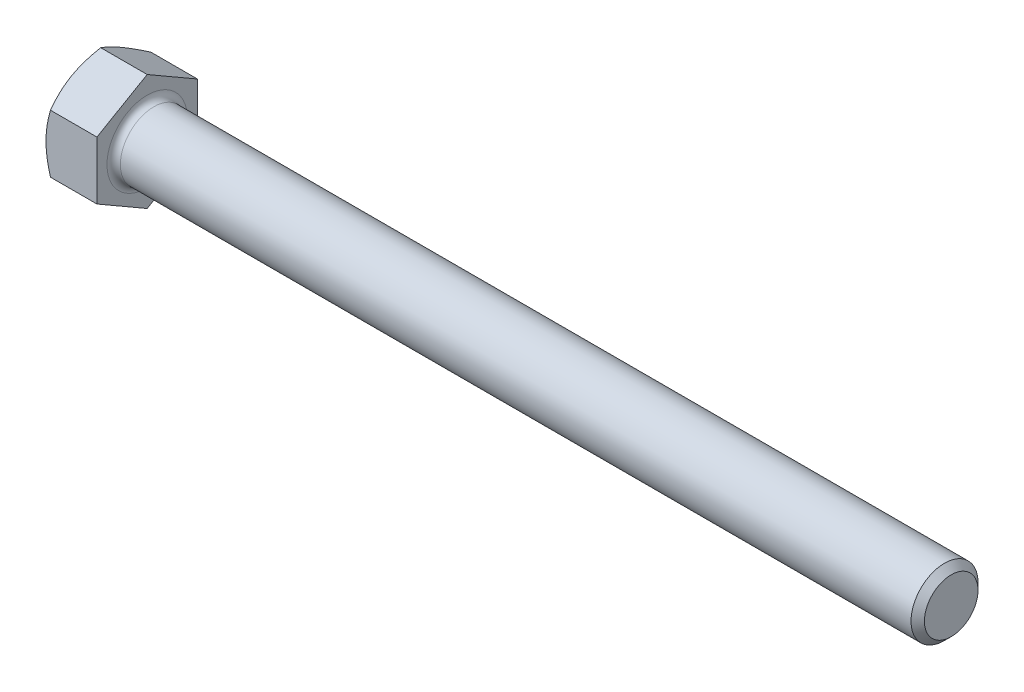
ISO-10303-21;
HEADER;
FILE_DESCRIPTION(('STEP AP214'),'2;1');
FILE_NAME('part.step','',(''),(''),'','','');
FILE_SCHEMA(('AUTOMOTIVE_DESIGN { 1 0 10303 214 1 1 1 1 }'));
ENDSEC;
DATA;
#1=APPLICATION_CONTEXT('core data for automotive mechanical design processes');
#2=APPLICATION_PROTOCOL_DEFINITION('international standard','automotive_design',2000,#1);
#3=PRODUCT_CONTEXT('',#1,'mechanical');
#4=PRODUCT('Part','Part','',(#3));
#5=PRODUCT_RELATED_PRODUCT_CATEGORY('part','',(#4));
#6=PRODUCT_DEFINITION_FORMATION('','',#4);
#7=PRODUCT_DEFINITION_CONTEXT('part definition',#1,'design');
#8=PRODUCT_DEFINITION('design','',#6,#7);
#9=PRODUCT_DEFINITION_SHAPE('','',#8);
#10=(LENGTH_UNIT() NAMED_UNIT(*) SI_UNIT(.MILLI.,.METRE.));
#11=(NAMED_UNIT(*) PLANE_ANGLE_UNIT() SI_UNIT($,.RADIAN.));
#12=(NAMED_UNIT(*) SI_UNIT($,.STERADIAN.) SOLID_ANGLE_UNIT());
#13=UNCERTAINTY_MEASURE_WITH_UNIT(LENGTH_MEASURE(1.E-05),#10,'distance_accuracy_value','');
#14=(GEOMETRIC_REPRESENTATION_CONTEXT(3) GLOBAL_UNCERTAINTY_ASSIGNED_CONTEXT((#13)) GLOBAL_UNIT_ASSIGNED_CONTEXT((#10,
#11,#12)) REPRESENTATION_CONTEXT('',''));
#15=CARTESIAN_POINT('',(0.,0.,0.));
#16=DIRECTION('',(0.,0.,1.));
#17=DIRECTION('',(1.,0.,0.));
#18=AXIS2_PLACEMENT_3D('',#15,#16,#17);
#19=CARTESIAN_POINT('',(-4.826,2.74963065701559,-4.7625));
#20=DIRECTION('',(0.,-0.866025403784439,0.499999999999999));
#21=DIRECTION('',(0.,-0.5,-0.866025403784439));
#22=AXIS2_PLACEMENT_3D('',#19,#20,#21);
#23=PLANE('',#22);
#24=CARTESIAN_POINT('',(-4.40056398824924,5.49937678408502,0.000200000000005412));
#25=CARTESIAN_POINT('',(-4.47034638758606,5.37853889601657,-0.209097361613873));
#26=CARTESIAN_POINT('',(-4.53381673538478,5.25666747870888,-0.420184848381223));
#27=CARTESIAN_POINT('',(-4.64460480393128,5.01081433128269,-0.846014990924108));
#28=CARTESIAN_POINT('',(-4.69188333457021,4.88682823299882,-1.060765212584));
#29=CARTESIAN_POINT('',(-4.76546647463122,4.64037371706653,-1.48763695593352));
#30=CARTESIAN_POINT('',(-4.79226120779827,4.5179436811604,-1.69969199849541));
#31=CARTESIAN_POINT('',(-4.81628887781912,4.33386795649884,-2.01852050604929));
#32=CARTESIAN_POINT('',(-4.82160535899069,4.27246738882597,-2.12486940887228));
#33=CARTESIAN_POINT('',(-4.8267598365683,4.1496095068933,-2.33766550248997));
#34=CARTESIAN_POINT('',(-4.82659800219079,4.08815219444488,-2.44411269014726));
#35=CARTESIAN_POINT('',(-4.81861505017809,3.9197756106675,-2.73574948805455));
#36=CARTESIAN_POINT('',(-4.80520757951211,3.81291212955969,-2.92084246680696));
#37=CARTESIAN_POINT('',(-4.76269213715631,3.59989441060936,-3.28979997894136));
#38=CARTESIAN_POINT('',(-4.7335696317199,3.49374092153974,-3.47366321541066));
#39=CARTESIAN_POINT('',(-4.6607707464131,3.28029401006835,-3.84336411079776));
#40=CARTESIAN_POINT('',(-4.61678588695335,3.17302752682367,-4.02915510972678));
#41=CARTESIAN_POINT('',(-4.51695772006118,2.96009430473234,-4.39796626900832));
#42=CARTESIAN_POINT('',(-4.46113786532195,2.85442483842812,-4.5809911534559));
#43=CARTESIAN_POINT('',(-4.40056398824924,2.74951518696175,-4.7627));
#44=B_SPLINE_CURVE_WITH_KNOTS('',3,(#24,#25,#26,#27,#28,#29,#30,#31,#32,#33,#34,#35,#36,#37,#38,
#39,#40,#41,#42,#43),.UNSPECIFIED.,.F.,.F.,(4,2,2,2,2,2,2,2,2,4),(0.,0.754910190012916,
1.51163483480638,2.24963134670894,2.61827336240839,2.9869039913527,3.62867423192249,
4.27103902109236,4.92765153591996,5.58297484368455),.UNSPECIFIED.);
#45=CARTESIAN_POINT('',(-4.4006306570156,5.49926131403118,0.));
#46=VERTEX_POINT('',#45);
#47=CARTESIAN_POINT('',(-4.826,4.12444598552339,-2.38124999999999));
#48=VERTEX_POINT('',#47);
#49=EDGE_CURVE('E112',#46,#48,#44,.T.);
#50=ORIENTED_EDGE('',*,*,#49,.F.);
#51=DIRECTION('',(1.,0.,0.));
#52=VECTOR('',#51,1.);
#53=CARTESIAN_POINT('',(-4.826,5.49926131403118,0.));
#54=LINE('',#53,#52);
#55=CARTESIAN_POINT('',(0.,5.49926131403118,0.));
#56=VERTEX_POINT('',#55);
#57=EDGE_CURVE('E125',#46,#56,#54,.T.);
#58=ORIENTED_EDGE('',*,*,#57,.T.);
#59=DIRECTION('',(0.,-0.5,-0.866025403784439));
#60=VECTOR('',#59,1.);
#61=CARTESIAN_POINT('',(0.,2.74963065701559,-4.7625));
#62=LINE('',#61,#60);
#63=CARTESIAN_POINT('',(0.,2.74963065701559,-4.7625));
#64=VERTEX_POINT('',#63);
#65=EDGE_CURVE('E129',#56,#64,#62,.T.);
#66=ORIENTED_EDGE('',*,*,#65,.T.);
#67=DIRECTION('',(1.,0.,0.));
#68=VECTOR('',#67,1.);
#69=CARTESIAN_POINT('',(-4.826,2.74963065701559,-4.7625));
#70=LINE('',#69,#68);
#71=CARTESIAN_POINT('',(-4.4006306570156,2.74963065701559,-4.7625));
#72=VERTEX_POINT('',#71);
#73=EDGE_CURVE('E148',#72,#64,#70,.T.);
#74=ORIENTED_EDGE('',*,*,#73,.F.);
#75=EDGE_CURVE('E128',#48,#72,#44,.T.);
#76=ORIENTED_EDGE('',*,*,#75,.F.);
#77=EDGE_LOOP('',(#50,#58,#66,#74,#76));
#78=FACE_BOUND('',#77,.T.);
#79=ADVANCED_FACE('F36',(#78),#23,.F.);
#80=CARTESIAN_POINT('',(-4.826,-2.74963065701559,-4.7625));
#81=DIRECTION('',(0.,0.,1.));
#82=DIRECTION('',(0.,-1.,0.));
#83=AXIS2_PLACEMENT_3D('',#80,#81,#82);
#84=PLANE('',#83);
#85=CARTESIAN_POINT('',(-2.53865492995422,-7.30971731156661,-4.7625));
#86=CARTESIAN_POINT('',(-2.63894582516318,-7.10233411794664,-4.7625));
#87=CARTESIAN_POINT('',(-2.73825279152594,-6.89446659321094,-4.7625));
#88=CARTESIAN_POINT('',(-2.93434388978706,-6.47750501700678,-4.7625));
#89=CARTESIAN_POINT('',(-3.03112760832201,-6.26841077136273,-4.7625));
#90=CARTESIAN_POINT('',(-3.22212058726197,-5.84762353880586,-4.7625));
#91=CARTESIAN_POINT('',(-3.31631227627624,-5.63592254799053,-4.7625));
#92=CARTESIAN_POINT('',(-3.50073783411751,-5.2108098706162,-4.7625));
#93=CARTESIAN_POINT('',(-3.59097189530315,-4.99739826779835,-4.7625));
#94=CARTESIAN_POINT('',(-3.76913037535412,-4.56193618326943,-4.7625));
#95=CARTESIAN_POINT('',(-3.85689893159286,-4.33982157619656,-4.7625));
#96=CARTESIAN_POINT('',(-4.02560705643309,-3.89296573863796,-4.7625));
#97=CARTESIAN_POINT('',(-4.10654584809015,-3.6682242126196,-4.7625));
#98=CARTESIAN_POINT('',(-4.25941364359694,-3.21620296888463,-4.7625));
#99=CARTESIAN_POINT('',(-4.33136156692013,-2.98892971583964,-4.7625));
#100=CARTESIAN_POINT('',(-4.46388883392356,-2.53112455985058,-4.7625));
#101=CARTESIAN_POINT('',(-4.52447184026846,-2.30059373259607,-4.7625));
#102=CARTESIAN_POINT('',(-4.6309943175041,-1.83740766983983,-4.7625));
#103=CARTESIAN_POINT('',(-4.67701029190918,-1.60477036374114,-4.7625));
#104=CARTESIAN_POINT('',(-4.75174576579707,-1.13668440796651,-4.7625));
#105=CARTESIAN_POINT('',(-4.78046675134188,-0.901236001606197,-4.7625));
#106=CARTESIAN_POINT('',(-4.81794377379008,-0.431746037216489,-4.7625));
#107=CARTESIAN_POINT('',(-4.82695039796689,-0.197724985343648,-4.7625));
#108=CARTESIAN_POINT('',(-4.82489021390358,0.270245165970698,-4.7625));
#109=CARTESIAN_POINT('',(-4.81382285651618,0.504194263268692,-4.7625));
#110=CARTESIAN_POINT('',(-4.77855727161905,0.903673507099814,-4.7625));
#111=CARTESIAN_POINT('',(-4.75901888428981,1.06963824347709,-4.7625));
#112=CARTESIAN_POINT('',(-4.71109832669434,1.4002949446895,-4.7625));
#113=CARTESIAN_POINT('',(-4.68271488786702,1.56498672348217,-4.7625));
#114=CARTESIAN_POINT('',(-4.58579509515289,2.05696621832222,-4.7625));
#115=CARTESIAN_POINT('',(-4.50550882608358,2.38196188542261,-4.7625));
#116=CARTESIAN_POINT('',(-4.36703014941268,2.86781398854699,-4.7625));
#117=CARTESIAN_POINT('',(-4.31723714803653,3.03120713132935,-4.7625));
#118=CARTESIAN_POINT('',(-4.21266440559822,3.35640511661037,-4.7625));
#119=CARTESIAN_POINT('',(-4.15788463273706,3.51820994897361,-4.7625));
#120=CARTESIAN_POINT('',(-4.04420190764095,3.84028616885704,-4.7625));
#121=CARTESIAN_POINT('',(-3.9853004369361,4.00055808407178,-4.7625));
#122=CARTESIAN_POINT('',(-3.86404874825557,4.31978669318692,-4.7625));
#123=CARTESIAN_POINT('',(-3.80169856215817,4.47874339922889,-4.7625));
#124=CARTESIAN_POINT('',(-3.65635700460677,4.8396055882017,-4.7625));
#125=CARTESIAN_POINT('',(-3.57245322794143,5.04114279911414,-4.7625));
#126=CARTESIAN_POINT('',(-3.40089342493739,5.44261795808367,-4.7625));
#127=CARTESIAN_POINT('',(-3.31323721756385,5.64255582842752,-4.76249999999999));
#128=CARTESIAN_POINT('',(-3.13488930867042,6.04110971320488,-4.76249999999999));
#129=CARTESIAN_POINT('',(-3.04419710529245,6.23972550252466,-4.76249999999999));
#130=CARTESIAN_POINT('',(-2.86034980666286,6.63581552297746,-4.76249999999999));
#131=CARTESIAN_POINT('',(-2.76719466563982,6.83328973281206,-4.76249999999999));
#132=CARTESIAN_POINT('',(-2.48455741628422,7.42461069797956,-4.76249999999999));
#133=CARTESIAN_POINT('',(-2.29205806653975,7.817014673705,-4.76249999999999));
#134=CARTESIAN_POINT('',(-1.90151383619552,8.5990520506164,-4.76249999999999));
#135=CARTESIAN_POINT('',(-1.70346877205877,8.98868535956997,-4.76249999999999));
#136=CARTESIAN_POINT('',(-1.31897377005232,9.7356118369776,-4.76249999999999));
#137=CARTESIAN_POINT('',(-1.13282282853607,10.093059202551,-4.76249999999999));
#138=CARTESIAN_POINT('',(-0.75794689692703,10.8066127209674,-4.76249999999999));
#139=CARTESIAN_POINT('',(-0.569221831900088,11.1627188343791,-4.76249999999999));
#140=CARTESIAN_POINT('',(-0.190210631481143,11.8730921528281,-4.76249999999999));
#141=CARTESIAN_POINT('',(7.11576984302486E-05,12.2273616797313,-4.76249999999999));
#142=CARTESIAN_POINT('',(0.382198882261842,12.9350341524318,-4.76249999999999));
#143=CARTESIAN_POINT('',(0.574044740694436,13.2884371397628,-4.76249999999999));
#144=CARTESIAN_POINT('',(0.766479229564005,13.6415169914972,-4.76249999999999));
#145=B_SPLINE_CURVE_WITH_KNOTS('',3,(#85,#86,#87,#88,#89,#90,#91,#92,#93,#94,#95,#96,#97,#98,
#99,#100,#101,#102,#103,#104,#105,#106,#107,#108,#109,#110,#111,#112,#113,#114,#115,#116,#117,
#118,#119,#120,#121,#122,#123,#124,#125,#126,#127,#128,#129,#130,#131,#132,#133,#134,#135,#136,
#137,#138,#139,#140,#141,#142,#143,#144),.UNSPECIFIED.,.F.,.F.,(4,2,2,2,2,2,2,2,2,2,2,2,2,2,2,2,
2,2,2,2,2,2,2,2,2,2,2,2,2,4),(0.,0.691090929530282,1.38229437243686,2.07739107275608,
2.77245395070163,3.48884745798766,4.20532235163324,4.92026322857102,5.63497329833932,
6.3458650497355,7.05669570944579,7.75843728919175,8.46019806619033,8.96128606484996,
9.46244596286593,10.4653546355007,10.9777490611263,11.4901467543507,12.0023612047988,
12.514570921371,13.1694362862203,13.8243332805291,14.4793390708444,15.1343570424044,
16.4455162651803,17.7567189325479,18.9657490980689,20.1748145345615,21.3812208217427,
22.5875681084214),.UNSPECIFIED.);
#146=CARTESIAN_POINT('',(-4.826,0.,-4.7625));
#147=VERTEX_POINT('',#146);
#148=EDGE_CURVE('E194',#72,#147,#145,.F.);
#149=ORIENTED_EDGE('',*,*,#148,.F.);
#150=ORIENTED_EDGE('',*,*,#73,.T.);
#151=DIRECTION('',(0.,-1.,0.));
#152=VECTOR('',#151,1.);
#153=CARTESIAN_POINT('',(0.,-2.74963065701559,-4.7625));
#154=LINE('',#153,#152);
#155=CARTESIAN_POINT('',(0.,-2.74963065701559,-4.7625));
#156=VERTEX_POINT('',#155);
#157=EDGE_CURVE('E404',#64,#156,#154,.T.);
#158=ORIENTED_EDGE('',*,*,#157,.T.);
#159=DIRECTION('',(1.,0.,0.));
#160=VECTOR('',#159,1.);
#161=CARTESIAN_POINT('',(-4.826,-2.74963065701559,-4.7625));
#162=LINE('',#161,#160);
#163=CARTESIAN_POINT('',(-4.4006306570156,-2.74963065701559,-4.7625));
#164=VERTEX_POINT('',#163);
#165=EDGE_CURVE('E146',#164,#156,#162,.T.);
#166=ORIENTED_EDGE('',*,*,#165,.F.);
#167=EDGE_CURVE('E195',#147,#164,#145,.F.);
#168=ORIENTED_EDGE('',*,*,#167,.F.);
#169=EDGE_LOOP('',(#149,#150,#158,#166,#168));
#170=FACE_BOUND('',#169,.T.);
#171=ADVANCED_FACE('F174',(#170),#84,.F.);
#172=CARTESIAN_POINT('',(-4.826,-5.49926131403118,0.));
#173=DIRECTION('',(0.,0.866025403784438,0.5));
#174=DIRECTION('',(0.,-0.5,0.866025403784438));
#175=AXIS2_PLACEMENT_3D('',#172,#173,#174);
#176=PLANE('',#175);
#177=CARTESIAN_POINT('',(-4.40056398824924,-2.74951518696175,-4.7627));
#178=CARTESIAN_POINT('',(-4.47034638758606,-2.8703530750302,-4.55340263838612));
#179=CARTESIAN_POINT('',(-4.53381673538478,-2.9922244923379,-4.34231515161877));
#180=CARTESIAN_POINT('',(-4.64460480393128,-3.23807763976409,-3.91648500907589));
#181=CARTESIAN_POINT('',(-4.69188333457021,-3.36206373804796,-3.701734787416));
#182=CARTESIAN_POINT('',(-4.76546647463122,-3.60851825398025,-3.27486304406647));
#183=CARTESIAN_POINT('',(-4.79226120779827,-3.73094828988637,-3.06280800150458));
#184=CARTESIAN_POINT('',(-4.81628887781913,-3.91502401454793,-2.7439794939507));
#185=CARTESIAN_POINT('',(-4.82160535899069,-3.97642458222081,-2.63763059112771));
#186=CARTESIAN_POINT('',(-4.8267598365683,-4.09928246415348,-2.42483449751002));
#187=CARTESIAN_POINT('',(-4.8265980021908,-4.16073977660189,-2.31838730985274));
#188=CARTESIAN_POINT('',(-4.81861505017809,-4.32911636037927,-2.02675051194544));
#189=CARTESIAN_POINT('',(-4.80520757951211,-4.43597984148709,-1.84165753319303));
#190=CARTESIAN_POINT('',(-4.76269213715631,-4.64899756043742,-1.47270002105863));
#191=CARTESIAN_POINT('',(-4.7335696317199,-4.75515104950704,-1.28883678458933));
#192=CARTESIAN_POINT('',(-4.6607707464131,-4.96859796097843,-0.919135889202234));
#193=CARTESIAN_POINT('',(-4.61678588695335,-5.07586444422311,-0.733344890273215));
#194=CARTESIAN_POINT('',(-4.51695772006118,-5.28879766631444,-0.364533730991682));
#195=CARTESIAN_POINT('',(-4.46113786532195,-5.39446713261865,-0.181508846544095));
#196=CARTESIAN_POINT('',(-4.40056398824924,-5.49937678408502,0.000199999999996824));
#197=B_SPLINE_CURVE_WITH_KNOTS('',3,(#177,#178,#179,#180,#181,#182,#183,#184,#185,#186,#187,
#188,#189,#190,#191,#192,#193,#194,#195,#196),.UNSPECIFIED.,.F.,.F.,(4,2,2,2,2,2,2,2,2,4),(0.,
0.754910190012917,1.51163483480638,2.24963134670895,2.61827336240839,2.9869039913527,
3.6286742319225,4.27103902109236,4.92765153591996,5.58297484368455),.UNSPECIFIED.);
#198=CARTESIAN_POINT('',(-4.826,-4.12444598552338,-2.38125));
#199=VERTEX_POINT('',#198);
#200=EDGE_CURVE('E233',#164,#199,#197,.T.);
#201=ORIENTED_EDGE('',*,*,#200,.F.);
#202=ORIENTED_EDGE('',*,*,#165,.T.);
#203=DIRECTION('',(0.,-0.5,0.866025403784438));
#204=VECTOR('',#203,1.);
#205=CARTESIAN_POINT('',(0.,-5.49926131403118,0.));
#206=LINE('',#205,#204);
#207=CARTESIAN_POINT('',(0.,-5.49926131403118,0.));
#208=VERTEX_POINT('',#207);
#209=EDGE_CURVE('E405',#156,#208,#206,.T.);
#210=ORIENTED_EDGE('',*,*,#209,.T.);
#211=DIRECTION('',(1.,0.,0.));
#212=VECTOR('',#211,1.);
#213=CARTESIAN_POINT('',(-4.826,-5.49926131403118,0.));
#214=LINE('',#213,#212);
#215=CARTESIAN_POINT('',(-4.4006306570156,-5.49926131403118,0.));
#216=VERTEX_POINT('',#215);
#217=EDGE_CURVE('E144',#216,#208,#214,.T.);
#218=ORIENTED_EDGE('',*,*,#217,.F.);
#219=EDGE_CURVE('E229',#199,#216,#197,.T.);
#220=ORIENTED_EDGE('',*,*,#219,.F.);
#221=EDGE_LOOP('',(#201,#202,#210,#218,#220));
#222=FACE_BOUND('',#221,.T.);
#223=ADVANCED_FACE('F179',(#222),#176,.F.);
#224=CARTESIAN_POINT('',(-4.826,-2.7496306570156,4.7625));
#225=DIRECTION('',(0.,0.866025403784439,-0.499999999999999));
#226=DIRECTION('',(0.,0.499999999999999,0.866025403784439));
#227=AXIS2_PLACEMENT_3D('',#224,#225,#226);
#228=PLANE('',#227);
#229=CARTESIAN_POINT('',(-4.40056398824924,-5.49937678408502,-0.000200000000003331));
#230=CARTESIAN_POINT('',(-4.47034638758606,-5.37853889601657,0.209097361613875));
#231=CARTESIAN_POINT('',(-4.53381673538478,-5.25666747870888,0.420184848381226));
#232=CARTESIAN_POINT('',(-4.64460480393128,-5.01081433128269,0.846014990924112));
#233=CARTESIAN_POINT('',(-4.69188333457021,-4.88682823299882,1.060765212584));
#234=CARTESIAN_POINT('',(-4.76546647463122,-4.64037371706653,1.48763695593353));
#235=CARTESIAN_POINT('',(-4.79226120779828,-4.5179436811604,1.69969199849541));
#236=CARTESIAN_POINT('',(-4.81628887781913,-4.33386795649884,2.0185205060493));
#237=CARTESIAN_POINT('',(-4.82160535899069,-4.27246738882597,2.12486940887228));
#238=CARTESIAN_POINT('',(-4.8267598365683,-4.1496095068933,2.33766550248998));
#239=CARTESIAN_POINT('',(-4.8265980021908,-4.08815219444488,2.44411269014726));
#240=CARTESIAN_POINT('',(-4.81861505017809,-3.9197756106675,2.73574948805456));
#241=CARTESIAN_POINT('',(-4.80520757951211,-3.81291212955969,2.92084246680697));
#242=CARTESIAN_POINT('',(-4.76269213715631,-3.59989441060936,3.28979997894137));
#243=CARTESIAN_POINT('',(-4.7335696317199,-3.49374092153974,3.47366321541067));
#244=CARTESIAN_POINT('',(-4.6607707464131,-3.28029401006835,3.84336411079776));
#245=CARTESIAN_POINT('',(-4.61678588695335,-3.17302752682367,4.02915510972678));
#246=CARTESIAN_POINT('',(-4.51695772006118,-2.96009430473234,4.39796626900832));
#247=CARTESIAN_POINT('',(-4.46113786532195,-2.85442483842813,4.5809911534559));
#248=CARTESIAN_POINT('',(-4.40056398824924,-2.74951518696176,4.7627));
#249=B_SPLINE_CURVE_WITH_KNOTS('',3,(#229,#230,#231,#232,#233,#234,#235,#236,#237,#238,#239,
#240,#241,#242,#243,#244,#245,#246,#247,#248),.UNSPECIFIED.,.F.,.F.,(4,2,2,2,2,2,2,2,2,4),(0.,
0.754910190012917,1.51163483480638,2.24963134670895,2.61827336240839,2.9869039913527,
3.62867423192249,4.27103902109236,4.92765153591996,5.58297484368455),.UNSPECIFIED.);
#250=CARTESIAN_POINT('',(-4.826,-4.12444598552339,2.38125));
#251=VERTEX_POINT('',#250);
#252=EDGE_CURVE('E59',#216,#251,#249,.T.);
#253=ORIENTED_EDGE('',*,*,#252,.F.);
#254=ORIENTED_EDGE('',*,*,#217,.T.);
#255=DIRECTION('',(0.,0.499999999999999,0.866025403784439));
#256=VECTOR('',#255,1.);
#257=CARTESIAN_POINT('',(0.,-2.7496306570156,4.7625));
#258=LINE('',#257,#256);
#259=CARTESIAN_POINT('',(0.,-2.7496306570156,4.7625));
#260=VERTEX_POINT('',#259);
#261=EDGE_CURVE('E401',#208,#260,#258,.T.);
#262=ORIENTED_EDGE('',*,*,#261,.T.);
#263=DIRECTION('',(1.,0.,0.));
#264=VECTOR('',#263,1.);
#265=CARTESIAN_POINT('',(-4.826,-2.7496306570156,4.7625));
#266=LINE('',#265,#264);
#267=CARTESIAN_POINT('',(-4.4006306570156,-2.7496306570156,4.7625));
#268=VERTEX_POINT('',#267);
#269=EDGE_CURVE('E137',#268,#260,#266,.T.);
#270=ORIENTED_EDGE('',*,*,#269,.F.);
#271=EDGE_CURVE('E224',#251,#268,#249,.T.);
#272=ORIENTED_EDGE('',*,*,#271,.F.);
#273=EDGE_LOOP('',(#253,#254,#262,#270,#272));
#274=FACE_BOUND('',#273,.T.);
#275=ADVANCED_FACE('F236',(#274),#228,.F.);
#276=CARTESIAN_POINT('',(-4.826,2.74963065701559,4.7625));
#277=DIRECTION('',(0.,0.,-1.));
#278=DIRECTION('',(0.,1.,0.));
#279=AXIS2_PLACEMENT_3D('',#276,#277,#278);
#280=PLANE('',#279);
#281=CARTESIAN_POINT('',(-2.53865492995422,-7.30971731156661,4.76249999999999));
#282=CARTESIAN_POINT('',(-2.63894582516318,-7.10233411794665,4.76249999999999));
#283=CARTESIAN_POINT('',(-2.73825279152594,-6.89446659321094,4.76249999999999));
#284=CARTESIAN_POINT('',(-2.93434388978706,-6.47750501700678,4.76249999999999));
#285=CARTESIAN_POINT('',(-3.03112760832201,-6.26841077136274,4.76249999999999));
#286=CARTESIAN_POINT('',(-3.22212058726197,-5.84762353880587,4.76249999999999));
#287=CARTESIAN_POINT('',(-3.31631227627624,-5.63592254799054,4.76249999999999));
#288=CARTESIAN_POINT('',(-3.50073783411751,-5.21080987061621,4.76249999999999));
#289=CARTESIAN_POINT('',(-3.59097189530315,-4.99739826779836,4.76249999999999));
#290=CARTESIAN_POINT('',(-3.76913037535412,-4.56193618326944,4.76249999999999));
#291=CARTESIAN_POINT('',(-3.85689893159286,-4.33982157619657,4.76249999999999));
#292=CARTESIAN_POINT('',(-4.02560705643309,-3.89296573863797,4.76249999999999));
#293=CARTESIAN_POINT('',(-4.10654584809015,-3.6682242126196,4.76249999999999));
#294=CARTESIAN_POINT('',(-4.25941364359694,-3.21620296888463,4.76249999999999));
#295=CARTESIAN_POINT('',(-4.33136156692013,-2.98892971583965,4.7625));
#296=CARTESIAN_POINT('',(-4.46388883392356,-2.53112455985059,4.7625));
#297=CARTESIAN_POINT('',(-4.52447184026846,-2.30059373259607,4.7625));
#298=CARTESIAN_POINT('',(-4.6309943175041,-1.83740766983984,4.7625));
#299=CARTESIAN_POINT('',(-4.67701029190918,-1.60477036374115,4.7625));
#300=CARTESIAN_POINT('',(-4.75174576579707,-1.13668440796652,4.7625));
#301=CARTESIAN_POINT('',(-4.78046675134188,-0.901236001606206,4.7625));
#302=CARTESIAN_POINT('',(-4.81794377379008,-0.431746037216497,4.7625));
#303=CARTESIAN_POINT('',(-4.82695039796689,-0.197724985343655,4.7625));
#304=CARTESIAN_POINT('',(-4.82489021390358,0.270245165970691,4.7625));
#305=CARTESIAN_POINT('',(-4.81382285651618,0.504194263268686,4.7625));
#306=CARTESIAN_POINT('',(-4.77855727161905,0.903673507099808,4.7625));
#307=CARTESIAN_POINT('',(-4.75901888428981,1.06963824347708,4.7625));
#308=CARTESIAN_POINT('',(-4.71109832669434,1.40029494468949,4.7625));
#309=CARTESIAN_POINT('',(-4.68271488786702,1.56498672348216,4.7625));
#310=CARTESIAN_POINT('',(-4.58579509515289,2.05696621832221,4.7625));
#311=CARTESIAN_POINT('',(-4.50550882608357,2.3819618854226,4.7625));
#312=CARTESIAN_POINT('',(-4.36703014941267,2.86781398854699,4.7625));
#313=CARTESIAN_POINT('',(-4.31723714803653,3.03120713132935,4.7625));
#314=CARTESIAN_POINT('',(-4.21266440559822,3.35640511661037,4.7625));
#315=CARTESIAN_POINT('',(-4.15788463273706,3.5182099489736,4.7625));
#316=CARTESIAN_POINT('',(-4.04420190764094,3.84028616885704,4.7625));
#317=CARTESIAN_POINT('',(-3.98530043693609,4.00055808407178,4.7625));
#318=CARTESIAN_POINT('',(-3.86404874825556,4.31978669318692,4.7625));
#319=CARTESIAN_POINT('',(-3.80169856215817,4.47874339922889,4.7625));
#320=CARTESIAN_POINT('',(-3.65635700460677,4.8396055882017,4.7625));
#321=CARTESIAN_POINT('',(-3.57245322794143,5.04114279911414,4.7625));
#322=CARTESIAN_POINT('',(-3.40089342493739,5.44261795808366,4.7625));
#323=CARTESIAN_POINT('',(-3.31323721756385,5.64255582842751,4.7625));
#324=CARTESIAN_POINT('',(-3.13488930867042,6.04110971320488,4.7625));
#325=CARTESIAN_POINT('',(-3.04419710529245,6.23972550252465,4.7625));
#326=CARTESIAN_POINT('',(-2.86034980666286,6.63581552297746,4.7625));
#327=CARTESIAN_POINT('',(-2.76719466563982,6.83328973281205,4.76250000000001));
#328=CARTESIAN_POINT('',(-2.48455741628422,7.42461069797955,4.76250000000001));
#329=CARTESIAN_POINT('',(-2.29205806653975,7.81701467370499,4.76250000000001));
#330=CARTESIAN_POINT('',(-1.90151383619552,8.5990520506164,4.76250000000001));
#331=CARTESIAN_POINT('',(-1.70346877205876,8.98868535956997,4.76250000000001));
#332=CARTESIAN_POINT('',(-1.31897377005232,9.7356118369776,4.76250000000001));
#333=CARTESIAN_POINT('',(-1.13282282853607,10.093059202551,4.76250000000001));
#334=CARTESIAN_POINT('',(-0.757946896927029,10.8066127209674,4.76250000000001));
#335=CARTESIAN_POINT('',(-0.569221831900086,11.162718834379,4.76250000000001));
#336=CARTESIAN_POINT('',(-0.190210631481141,11.8730921528281,4.76250000000001));
#337=CARTESIAN_POINT('',(7.11576984315497E-05,12.2273616797313,4.76250000000001));
#338=CARTESIAN_POINT('',(0.382198882261843,12.9350341524318,4.76250000000001));
#339=CARTESIAN_POINT('',(0.574044740694438,13.2884371397628,4.76250000000001));
#340=CARTESIAN_POINT('',(0.766479229564007,13.6415169914972,4.76250000000001));
#341=B_SPLINE_CURVE_WITH_KNOTS('',3,(#281,#282,#283,#284,#285,#286,#287,#288,#289,#290,#291,
#292,#293,#294,#295,#296,#297,#298,#299,#300,#301,#302,#303,#304,#305,#306,#307,#308,#309,#310,
#311,#312,#313,#314,#315,#316,#317,#318,#319,#320,#321,#322,#323,#324,#325,#326,#327,#328,#329,
#330,#331,#332,#333,#334,#335,#336,#337,#338,#339,#340),.UNSPECIFIED.,.F.,.F.,(4,2,2,2,2,2,2,2,
2,2,2,2,2,2,2,2,2,2,2,2,2,2,2,2,2,2,2,2,2,4),(0.,0.691090929530282,1.38229437243686,
2.07739107275608,2.77245395070163,3.48884745798766,4.20532235163324,4.92026322857102,
5.63497329833932,6.3458650497355,7.05669570944579,7.75843728919175,8.46019806619033,
8.96128606484995,9.46244596286593,10.4653546355007,10.9777490611263,11.4901467543506,
12.0023612047988,12.514570921371,13.1694362862203,13.8243332805291,14.4793390708444,
15.1343570424044,16.4455162651803,17.7567189325479,18.9657490980689,20.1748145345615,
21.3812208217427,22.5875681084214),.UNSPECIFIED.);
#342=CARTESIAN_POINT('',(-4.826,0.,4.7625));
#343=VERTEX_POINT('',#342);
#344=EDGE_CURVE('E51',#268,#343,#341,.T.);
#345=ORIENTED_EDGE('',*,*,#344,.F.);
#346=ORIENTED_EDGE('',*,*,#269,.T.);
#347=DIRECTION('',(0.,1.,0.));
#348=VECTOR('',#347,1.);
#349=CARTESIAN_POINT('',(0.,2.74963065701559,4.7625));
#350=LINE('',#349,#348);
#351=CARTESIAN_POINT('',(0.,2.74963065701559,4.7625));
#352=VERTEX_POINT('',#351);
#353=EDGE_CURVE('E139',#260,#352,#350,.T.);
#354=ORIENTED_EDGE('',*,*,#353,.T.);
#355=DIRECTION('',(1.,0.,0.));
#356=VECTOR('',#355,1.);
#357=CARTESIAN_POINT('',(-4.826,2.74963065701559,4.7625));
#358=LINE('',#357,#356);
#359=CARTESIAN_POINT('',(-4.4006306570156,2.74963065701559,4.7625));
#360=VERTEX_POINT('',#359);
#361=EDGE_CURVE('E135',#360,#352,#358,.T.);
#362=ORIENTED_EDGE('',*,*,#361,.F.);
#363=EDGE_CURVE('E217',#343,#360,#341,.T.);
#364=ORIENTED_EDGE('',*,*,#363,.F.);
#365=EDGE_LOOP('',(#345,#346,#354,#362,#364));
#366=FACE_BOUND('',#365,.T.);
#367=ADVANCED_FACE('F240',(#366),#280,.F.);
#368=CARTESIAN_POINT('',(-4.826,5.49926131403118,0.));
#369=DIRECTION('',(0.,-0.866025403784438,-0.500000000000001));
#370=DIRECTION('',(0.,0.500000000000001,-0.866025403784438));
#371=AXIS2_PLACEMENT_3D('',#368,#369,#370);
#372=PLANE('',#371);
#373=CARTESIAN_POINT('',(-4.40056398824924,2.74951518696175,4.7627));
#374=CARTESIAN_POINT('',(-4.47034638758606,2.8703530750302,4.55340263838612));
#375=CARTESIAN_POINT('',(-4.53381673538478,2.99222449233789,4.34231515161877));
#376=CARTESIAN_POINT('',(-4.64460480393128,3.23807763976408,3.91648500907589));
#377=CARTESIAN_POINT('',(-4.69188333457021,3.36206373804795,3.701734787416));
#378=CARTESIAN_POINT('',(-4.76546647463122,3.60851825398025,3.27486304406647));
#379=CARTESIAN_POINT('',(-4.79226120779827,3.73094828988637,3.06280800150459));
#380=CARTESIAN_POINT('',(-4.81628887781912,3.91502401454793,2.74397949395071));
#381=CARTESIAN_POINT('',(-4.82160535899069,3.9764245822208,2.63763059112772));
#382=CARTESIAN_POINT('',(-4.82675983656829,4.09928246415348,2.42483449751003));
#383=CARTESIAN_POINT('',(-4.82659800219079,4.16073977660189,2.31838730985274));
#384=CARTESIAN_POINT('',(-4.81861505017809,4.32911636037927,2.02675051194544));
#385=CARTESIAN_POINT('',(-4.80520757951211,4.43597984148708,1.84165753319304));
#386=CARTESIAN_POINT('',(-4.76269213715631,4.64899756043741,1.47270002105863));
#387=CARTESIAN_POINT('',(-4.7335696317199,4.75515104950704,1.28883678458934));
#388=CARTESIAN_POINT('',(-4.6607707464131,4.96859796097843,0.919135889202238));
#389=CARTESIAN_POINT('',(-4.61678588695335,5.07586444422311,0.733344890273218));
#390=CARTESIAN_POINT('',(-4.51695772006118,5.28879766631444,0.364533730991684));
#391=CARTESIAN_POINT('',(-4.46113786532195,5.39446713261865,0.181508846544098));
#392=CARTESIAN_POINT('',(-4.40056398824924,5.49937678408502,-0.000199999999993792));
#393=B_SPLINE_CURVE_WITH_KNOTS('',3,(#373,#374,#375,#376,#377,#378,#379,#380,#381,#382,#383,
#384,#385,#386,#387,#388,#389,#390,#391,#392),.UNSPECIFIED.,.F.,.F.,(4,2,2,2,2,2,2,2,2,4),(0.,
0.754910190012917,1.51163483480638,2.24963134670895,2.61827336240839,2.9869039913527,
3.62867423192249,4.27103902109236,4.92765153591996,5.58297484368455),.UNSPECIFIED.);
#394=CARTESIAN_POINT('',(-4.826,4.12444598552339,2.38125));
#395=VERTEX_POINT('',#394);
#396=EDGE_CURVE('E119',#360,#395,#393,.T.);
#397=ORIENTED_EDGE('',*,*,#396,.F.);
#398=ORIENTED_EDGE('',*,*,#361,.T.);
#399=DIRECTION('',(0.,0.500000000000001,-0.866025403784438));
#400=VECTOR('',#399,1.);
#401=CARTESIAN_POINT('',(0.,5.49926131403118,0.));
#402=LINE('',#401,#400);
#403=EDGE_CURVE('E133',#352,#56,#402,.T.);
#404=ORIENTED_EDGE('',*,*,#403,.T.);
#405=ORIENTED_EDGE('',*,*,#57,.F.);
#406=EDGE_CURVE('E109',#395,#46,#393,.T.);
#407=ORIENTED_EDGE('',*,*,#406,.F.);
#408=EDGE_LOOP('',(#397,#398,#404,#405,#407));
#409=FACE_BOUND('',#408,.T.);
#410=ADVANCED_FACE('F131',(#409),#372,.F.);
#411=CARTESIAN_POINT('',(76.2,0.,0.));
#412=DIRECTION('',(1.,0.,0.));
#413=DIRECTION('',(0.,1.,0.));
#414=AXIS2_PLACEMENT_3D('',#411,#412,#413);
#415=PLANE('',#414);
#416=CARTESIAN_POINT('',(76.2,0.,0.));
#417=DIRECTION('',(1.,0.,0.));
#418=DIRECTION('',(0.,1.,0.));
#419=AXIS2_PLACEMENT_3D('',#416,#417,#418);
#420=CIRCLE('',#419,2.53990000000003);
#421=CARTESIAN_POINT('',(76.2,2.53990000000003,0.));
#422=VERTEX_POINT('',#421);
#423=EDGE_CURVE('E153',#422,#422,#420,.T.);
#424=ORIENTED_EDGE('',*,*,#423,.T.);
#425=EDGE_LOOP('',(#424));
#426=FACE_BOUND('',#425,.T.);
#427=ADVANCED_FACE('F247',(#426),#415,.T.);
#428=CARTESIAN_POINT('',(76.2,0.,0.));
#429=DIRECTION('',(1.,0.,0.));
#430=DIRECTION('',(0.,1.,0.));
#431=AXIS2_PLACEMENT_3D('',#428,#429,#430);
#432=CYLINDRICAL_SURFACE('',#431,3.175);
#433=CARTESIAN_POINT('',(0.634999999999997,0.,0.));
#434=DIRECTION('',(1.,0.,0.));
#435=DIRECTION('',(0.,1.,0.));
#436=AXIS2_PLACEMENT_3D('',#433,#434,#435);
#437=CIRCLE('',#436,3.175);
#438=CARTESIAN_POINT('',(0.634999999999996,3.175,0.));
#439=VERTEX_POINT('',#438);
#440=EDGE_CURVE('E11',#439,#439,#437,.T.);
#441=ORIENTED_EDGE('',*,*,#440,.T.);
#442=EDGE_LOOP('',(#441));
#443=FACE_BOUND('',#442,.T.);
#444=CARTESIAN_POINT('',(75.565,0.,0.));
#445=DIRECTION('',(1.,0.,0.));
#446=DIRECTION('',(0.,1.,0.));
#447=AXIS2_PLACEMENT_3D('',#444,#445,#446);
#448=CIRCLE('',#447,3.175);
#449=CARTESIAN_POINT('',(75.565,3.17500000000001,0.));
#450=VERTEX_POINT('',#449);
#451=EDGE_CURVE('E156',#450,#450,#448,.F.);
#452=ORIENTED_EDGE('',*,*,#451,.T.);
#453=EDGE_LOOP('',(#452));
#454=FACE_BOUND('',#453,.T.);
#455=ADVANCED_FACE('F186',(#443,#454),#432,.T.);
#456=CARTESIAN_POINT('',(0.,0.,0.));
#457=DIRECTION('',(1.,0.,0.));
#458=DIRECTION('',(0.,1.,0.));
#459=AXIS2_PLACEMENT_3D('',#456,#457,#458);
#460=PLANE('',#459);
#461=CARTESIAN_POINT('',(0.,0.,0.));
#462=DIRECTION('',(1.,0.,0.));
#463=DIRECTION('',(0.,1.,0.));
#464=AXIS2_PLACEMENT_3D('',#461,#462,#463);
#465=CIRCLE('',#464,3.81);
#466=CARTESIAN_POINT('',(0.,3.81,0.));
#467=VERTEX_POINT('',#466);
#468=EDGE_CURVE('E44',#467,#467,#465,.F.);
#469=ORIENTED_EDGE('',*,*,#468,.T.);
#470=EDGE_LOOP('',(#469));
#471=FACE_BOUND('',#470,.T.);
#472=ORIENTED_EDGE('',*,*,#65,.F.);
#473=ORIENTED_EDGE('',*,*,#403,.F.);
#474=ORIENTED_EDGE('',*,*,#353,.F.);
#475=ORIENTED_EDGE('',*,*,#261,.F.);
#476=ORIENTED_EDGE('',*,*,#209,.F.);
#477=ORIENTED_EDGE('',*,*,#157,.F.);
#478=EDGE_LOOP('',(#472,#473,#474,#475,#476,#477));
#479=FACE_BOUND('',#478,.T.);
#480=ADVANCED_FACE('F161',(#471,#479),#460,.T.);
#481=CARTESIAN_POINT('',(-4.826,0.,0.));
#482=DIRECTION('',(1.,0.,0.));
#483=DIRECTION('',(0.,1.,0.));
#484=AXIS2_PLACEMENT_3D('',#481,#482,#483);
#485=CONICAL_SURFACE('',#484,4.7625,1.0471975511966);
#486=ORIENTED_EDGE('',*,*,#49,.T.);
#487=CARTESIAN_POINT('',(-4.826,0.,0.));
#488=DIRECTION('',(1.,0.,0.));
#489=DIRECTION('',(0.,1.,0.));
#490=AXIS2_PLACEMENT_3D('',#487,#488,#489);
#491=CIRCLE('',#490,4.7625);
#492=EDGE_CURVE('E114',#48,#395,#491,.T.);
#493=ORIENTED_EDGE('',*,*,#492,.T.);
#494=ORIENTED_EDGE('',*,*,#406,.T.);
#495=EDGE_LOOP('',(#486,#493,#494));
#496=FACE_BOUND('',#495,.T.);
#497=ADVANCED_FACE('F111',(#496),#485,.T.);
#498=ORIENTED_EDGE('',*,*,#75,.T.);
#499=ORIENTED_EDGE('',*,*,#148,.T.);
#500=EDGE_CURVE('E151',#147,#48,#491,.T.);
#501=ORIENTED_EDGE('',*,*,#500,.T.);
#502=EDGE_LOOP('',(#498,#499,#501));
#503=FACE_BOUND('',#502,.T.);
#504=ADVANCED_FACE('F204',(#503),#485,.T.);
#505=ORIENTED_EDGE('',*,*,#167,.T.);
#506=ORIENTED_EDGE('',*,*,#200,.T.);
#507=EDGE_CURVE('E383',#199,#147,#491,.T.);
#508=ORIENTED_EDGE('',*,*,#507,.T.);
#509=EDGE_LOOP('',(#505,#506,#508));
#510=FACE_BOUND('',#509,.T.);
#511=ADVANCED_FACE('F304',(#510),#485,.T.);
#512=ORIENTED_EDGE('',*,*,#219,.T.);
#513=ORIENTED_EDGE('',*,*,#252,.T.);
#514=EDGE_CURVE('E382',#251,#199,#491,.T.);
#515=ORIENTED_EDGE('',*,*,#514,.T.);
#516=EDGE_LOOP('',(#512,#513,#515));
#517=FACE_BOUND('',#516,.T.);
#518=ADVANCED_FACE('F312',(#517),#485,.T.);
#519=ORIENTED_EDGE('',*,*,#271,.T.);
#520=ORIENTED_EDGE('',*,*,#344,.T.);
#521=CARTESIAN_POINT('',(-4.826,0.,0.));
#522=DIRECTION('',(-1.,0.,0.));
#523=DIRECTION('',(0.,-1.,0.));
#524=AXIS2_PLACEMENT_3D('',#521,#522,#523);
#525=CIRCLE('',#524,4.7625);
#526=EDGE_CURVE('E120',#251,#343,#525,.T.);
#527=ORIENTED_EDGE('',*,*,#526,.F.);
#528=EDGE_LOOP('',(#519,#520,#527));
#529=FACE_BOUND('',#528,.T.);
#530=ADVANCED_FACE('F320',(#529),#485,.T.);
#531=ORIENTED_EDGE('',*,*,#363,.T.);
#532=ORIENTED_EDGE('',*,*,#396,.T.);
#533=EDGE_CURVE('E152',#395,#343,#491,.T.);
#534=ORIENTED_EDGE('',*,*,#533,.T.);
#535=EDGE_LOOP('',(#531,#532,#534));
#536=FACE_BOUND('',#535,.T.);
#537=ADVANCED_FACE('F205',(#536),#485,.T.);
#538=CARTESIAN_POINT('',(-4.826,0.,0.));
#539=DIRECTION('',(1.,0.,0.));
#540=DIRECTION('',(0.,1.,0.));
#541=AXIS2_PLACEMENT_3D('',#538,#539,#540);
#542=PLANE('',#541);
#543=ORIENTED_EDGE('',*,*,#533,.F.);
#544=ORIENTED_EDGE('',*,*,#492,.F.);
#545=ORIENTED_EDGE('',*,*,#500,.F.);
#546=ORIENTED_EDGE('',*,*,#507,.F.);
#547=ORIENTED_EDGE('',*,*,#514,.F.);
#548=ORIENTED_EDGE('',*,*,#526,.T.);
#549=EDGE_LOOP('',(#543,#544,#545,#546,#547,#548));
#550=FACE_BOUND('',#549,.T.);
#551=ADVANCED_FACE('F170',(#550),#542,.F.);
#552=CARTESIAN_POINT('',(76.2,0.,0.));
#553=DIRECTION('',(-1.,0.,0.));
#554=DIRECTION('',(0.,-1.,0.));
#555=AXIS2_PLACEMENT_3D('',#552,#553,#554);
#556=CONICAL_SURFACE('',#555,2.53990000000003,0.785476897355248);
#557=ORIENTED_EDGE('',*,*,#451,.F.);
#558=EDGE_LOOP('',(#557));
#559=FACE_BOUND('',#558,.T.);
#560=ORIENTED_EDGE('',*,*,#423,.F.);
#561=EDGE_LOOP('',(#560));
#562=FACE_BOUND('',#561,.T.);
#563=ADVANCED_FACE('F165',(#559,#562),#556,.T.);
#564=CARTESIAN_POINT('',(0.634999999999997,0.,0.));
#565=DIRECTION('',(1.,0.,0.));
#566=DIRECTION('',(0.,1.,0.));
#567=AXIS2_PLACEMENT_3D('',#564,#565,#566);
#568=TOROIDAL_SURFACE('',#567,3.81,0.635);
#569=ORIENTED_EDGE('',*,*,#440,.F.);
#570=EDGE_LOOP('',(#569));
#571=FACE_BOUND('',#570,.T.);
#572=ORIENTED_EDGE('',*,*,#468,.F.);
#573=EDGE_LOOP('',(#572));
#574=FACE_BOUND('',#573,.T.);
#575=ADVANCED_FACE('F38',(#571,#574),#568,.F.);
#576=CLOSED_SHELL('',(#79,#171,#223,#275,#367,#410,#427,#455,#480,#497,#504,#511,#518,#530,#537,
#551,#563,#575));
#577=MANIFOLD_SOLID_BREP('B2',#576);
#578=ADVANCED_BREP_SHAPE_REPRESENTATION('',(#18,#577),#14);
#579=SHAPE_DEFINITION_REPRESENTATION(#9,#578);
ENDSEC;
END-ISO-10303-21;
